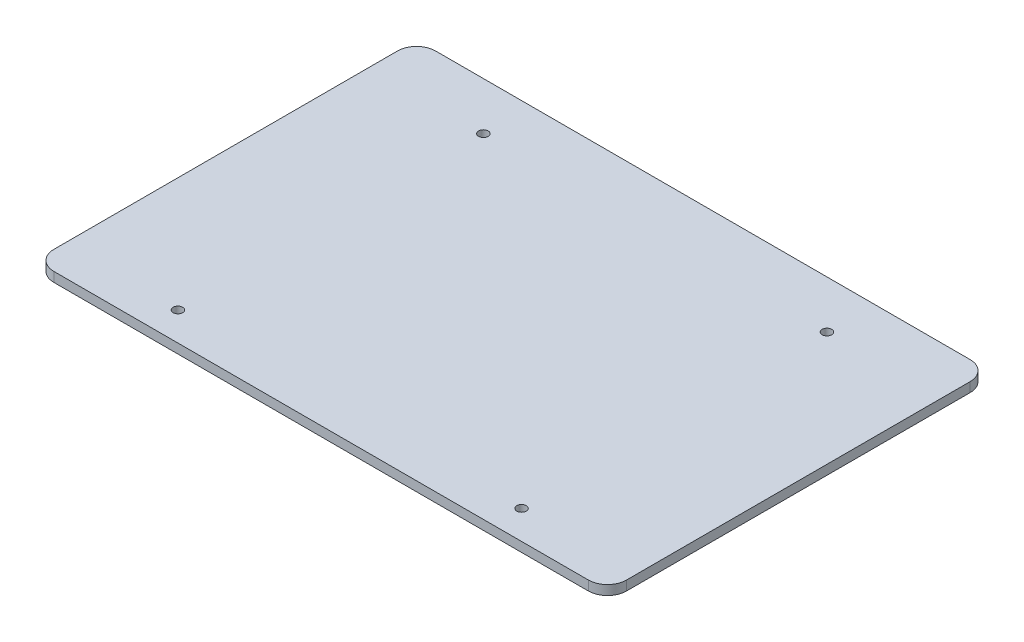
ISO-10303-21;
HEADER;
FILE_DESCRIPTION(('STEP AP214'),'2;1');
FILE_NAME('part.step','',(''),(''),'','','');
FILE_SCHEMA(('AUTOMOTIVE_DESIGN { 1 0 10303 214 1 1 1 1 }'));
ENDSEC;
DATA;
#1=APPLICATION_CONTEXT('core data for automotive mechanical design processes');
#2=APPLICATION_PROTOCOL_DEFINITION('international standard','automotive_design',2000,#1);
#3=PRODUCT_CONTEXT('',#1,'mechanical');
#4=PRODUCT('Part','Part','',(#3));
#5=PRODUCT_RELATED_PRODUCT_CATEGORY('part','',(#4));
#6=PRODUCT_DEFINITION_FORMATION('','',#4);
#7=PRODUCT_DEFINITION_CONTEXT('part definition',#1,'design');
#8=PRODUCT_DEFINITION('design','',#6,#7);
#9=PRODUCT_DEFINITION_SHAPE('','',#8);
#10=(LENGTH_UNIT() NAMED_UNIT(*) SI_UNIT(.MILLI.,.METRE.));
#11=(NAMED_UNIT(*) PLANE_ANGLE_UNIT() SI_UNIT($,.RADIAN.));
#12=(NAMED_UNIT(*) SI_UNIT($,.STERADIAN.) SOLID_ANGLE_UNIT());
#13=UNCERTAINTY_MEASURE_WITH_UNIT(LENGTH_MEASURE(1.E-05),#10,'distance_accuracy_value','');
#14=(GEOMETRIC_REPRESENTATION_CONTEXT(3) GLOBAL_UNCERTAINTY_ASSIGNED_CONTEXT((#13)) GLOBAL_UNIT_ASSIGNED_CONTEXT((#10,
#11,#12)) REPRESENTATION_CONTEXT('',''));
#15=CARTESIAN_POINT('',(0.,0.,0.));
#16=DIRECTION('',(0.,0.,1.));
#17=DIRECTION('',(1.,0.,0.));
#18=AXIS2_PLACEMENT_3D('',#15,#16,#17);
#19=CARTESIAN_POINT('',(140.,5.,90.));
#20=DIRECTION('',(0.,-1.,0.));
#21=DIRECTION('',(0.,0.,-1.));
#22=AXIS2_PLACEMENT_3D('',#19,#20,#21);
#23=PLANE('',#22);
#24=CARTESIAN_POINT('',(140.,5.,90.));
#25=DIRECTION('',(0.,1.,0.));
#26=DIRECTION('',(0.,0.,-1.));
#27=AXIS2_PLACEMENT_3D('',#24,#25,#26);
#28=CIRCLE('',#27,10.);
#29=CARTESIAN_POINT('',(140.,5.,100.));
#30=VERTEX_POINT('',#29);
#31=CARTESIAN_POINT('',(150.,5.,90.));
#32=VERTEX_POINT('',#31);
#33=EDGE_CURVE('E146',#30,#32,#28,.T.);
#34=ORIENTED_EDGE('',*,*,#33,.T.);
#35=DIRECTION('',(0.,0.,-1.));
#36=VECTOR('',#35,1.);
#37=CARTESIAN_POINT('',(150.,5.,90.));
#38=LINE('',#37,#36);
#39=CARTESIAN_POINT('',(150.,5.,-90.));
#40=VERTEX_POINT('',#39);
#41=EDGE_CURVE('E94',#32,#40,#38,.T.);
#42=ORIENTED_EDGE('',*,*,#41,.T.);
#43=CARTESIAN_POINT('',(140.,5.,-90.));
#44=DIRECTION('',(0.,1.,0.));
#45=DIRECTION('',(0.,0.,-1.));
#46=AXIS2_PLACEMENT_3D('',#43,#44,#45);
#47=CIRCLE('',#46,10.);
#48=CARTESIAN_POINT('',(140.,5.,-100.));
#49=VERTEX_POINT('',#48);
#50=EDGE_CURVE('E161',#40,#49,#47,.T.);
#51=ORIENTED_EDGE('',*,*,#50,.T.);
#52=DIRECTION('',(-1.,0.,0.));
#53=VECTOR('',#52,1.);
#54=CARTESIAN_POINT('',(-140.,5.,-100.));
#55=LINE('',#54,#53);
#56=CARTESIAN_POINT('',(-140.,5.,-100.));
#57=VERTEX_POINT('',#56);
#58=EDGE_CURVE('E174',#49,#57,#55,.T.);
#59=ORIENTED_EDGE('',*,*,#58,.T.);
#60=CARTESIAN_POINT('',(-140.,5.,-90.));
#61=DIRECTION('',(0.,1.,0.));
#62=DIRECTION('',(0.,0.,1.));
#63=AXIS2_PLACEMENT_3D('',#60,#61,#62);
#64=CIRCLE('',#63,10.);
#65=CARTESIAN_POINT('',(-150.,5.,-90.));
#66=VERTEX_POINT('',#65);
#67=EDGE_CURVE('E113',#57,#66,#64,.T.);
#68=ORIENTED_EDGE('',*,*,#67,.T.);
#69=DIRECTION('',(0.,0.,1.));
#70=VECTOR('',#69,1.);
#71=CARTESIAN_POINT('',(-150.,5.,90.));
#72=LINE('',#71,#70);
#73=CARTESIAN_POINT('',(-150.,5.,90.));
#74=VERTEX_POINT('',#73);
#75=EDGE_CURVE('E107',#66,#74,#72,.T.);
#76=ORIENTED_EDGE('',*,*,#75,.T.);
#77=CARTESIAN_POINT('',(-140.,5.,90.));
#78=DIRECTION('',(0.,1.,0.));
#79=DIRECTION('',(0.,0.,-1.));
#80=AXIS2_PLACEMENT_3D('',#77,#78,#79);
#81=CIRCLE('',#80,10.);
#82=CARTESIAN_POINT('',(-140.,5.,100.));
#83=VERTEX_POINT('',#82);
#84=EDGE_CURVE('E111',#74,#83,#81,.T.);
#85=ORIENTED_EDGE('',*,*,#84,.T.);
#86=DIRECTION('',(1.,0.,0.));
#87=VECTOR('',#86,1.);
#88=CARTESIAN_POINT('',(-140.,5.,100.));
#89=LINE('',#88,#87);
#90=EDGE_CURVE('E51',#83,#30,#89,.T.);
#91=ORIENTED_EDGE('',*,*,#90,.T.);
#92=EDGE_LOOP('',(#34,#42,#51,#59,#68,#76,#85,#91));
#93=FACE_BOUND('',#92,.T.);
#94=CARTESIAN_POINT('',(-89.9999999999999,5.,85.));
#95=DIRECTION('',(0.,1.,0.));
#96=DIRECTION('',(0.,0.,1.));
#97=AXIS2_PLACEMENT_3D('',#94,#95,#96);
#98=CIRCLE('',#97,2.5);
#99=CARTESIAN_POINT('',(-89.9999999999999,5.,87.5));
#100=VERTEX_POINT('',#99);
#101=EDGE_CURVE('E135',#100,#100,#98,.T.);
#102=ORIENTED_EDGE('',*,*,#101,.F.);
#103=EDGE_LOOP('',(#102));
#104=FACE_BOUND('',#103,.T.);
#105=CARTESIAN_POINT('',(90.0000000000001,5.,85.));
#106=DIRECTION('',(0.,1.,0.));
#107=DIRECTION('',(0.,0.,1.));
#108=AXIS2_PLACEMENT_3D('',#105,#106,#107);
#109=CIRCLE('',#108,2.5);
#110=CARTESIAN_POINT('',(90.0000000000001,5.,87.5));
#111=VERTEX_POINT('',#110);
#112=EDGE_CURVE('E183',#111,#111,#109,.T.);
#113=ORIENTED_EDGE('',*,*,#112,.F.);
#114=EDGE_LOOP('',(#113));
#115=FACE_BOUND('',#114,.T.);
#116=CARTESIAN_POINT('',(90.,5.,-75.));
#117=DIRECTION('',(0.,1.,0.));
#118=DIRECTION('',(0.,0.,1.));
#119=AXIS2_PLACEMENT_3D('',#116,#117,#118);
#120=CIRCLE('',#119,2.50000000000001);
#121=CARTESIAN_POINT('',(90.,5.,-72.5));
#122=VERTEX_POINT('',#121);
#123=EDGE_CURVE('E189',#122,#122,#120,.T.);
#124=ORIENTED_EDGE('',*,*,#123,.F.);
#125=EDGE_LOOP('',(#124));
#126=FACE_BOUND('',#125,.T.);
#127=CARTESIAN_POINT('',(-89.9999999999999,5.,-75.));
#128=DIRECTION('',(0.,1.,0.));
#129=DIRECTION('',(0.,0.,1.));
#130=AXIS2_PLACEMENT_3D('',#127,#128,#129);
#131=CIRCLE('',#130,2.5);
#132=CARTESIAN_POINT('',(-89.9999999999999,5.,-72.5));
#133=VERTEX_POINT('',#132);
#134=EDGE_CURVE('E195',#133,#133,#131,.T.);
#135=ORIENTED_EDGE('',*,*,#134,.F.);
#136=EDGE_LOOP('',(#135));
#137=FACE_BOUND('',#136,.T.);
#138=ADVANCED_FACE('F34',(#93,#104,#115,#126,#137),#23,.F.);
#139=CARTESIAN_POINT('',(140.,0.,90.));
#140=DIRECTION('',(0.,-1.,0.));
#141=DIRECTION('',(0.,0.,-1.));
#142=AXIS2_PLACEMENT_3D('',#139,#140,#141);
#143=PLANE('',#142);
#144=CARTESIAN_POINT('',(90.,0.,-75.));
#145=DIRECTION('',(0.,1.,0.));
#146=DIRECTION('',(0.,0.,1.));
#147=AXIS2_PLACEMENT_3D('',#144,#145,#146);
#148=CIRCLE('',#147,2.50000000000001);
#149=CARTESIAN_POINT('',(90.,0.,-72.5));
#150=VERTEX_POINT('',#149);
#151=EDGE_CURVE('E192',#150,#150,#148,.T.);
#152=ORIENTED_EDGE('',*,*,#151,.T.);
#153=EDGE_LOOP('',(#152));
#154=FACE_BOUND('',#153,.T.);
#155=CARTESIAN_POINT('',(-89.9999999999999,0.,85.));
#156=DIRECTION('',(0.,1.,0.));
#157=DIRECTION('',(0.,0.,1.));
#158=AXIS2_PLACEMENT_3D('',#155,#156,#157);
#159=CIRCLE('',#158,2.5);
#160=CARTESIAN_POINT('',(-89.9999999999999,0.,87.5));
#161=VERTEX_POINT('',#160);
#162=EDGE_CURVE('E180',#161,#161,#159,.T.);
#163=ORIENTED_EDGE('',*,*,#162,.T.);
#164=EDGE_LOOP('',(#163));
#165=FACE_BOUND('',#164,.T.);
#166=CARTESIAN_POINT('',(140.,0.,90.));
#167=DIRECTION('',(0.,1.,0.));
#168=DIRECTION('',(0.,0.,-1.));
#169=AXIS2_PLACEMENT_3D('',#166,#167,#168);
#170=CIRCLE('',#169,10.);
#171=CARTESIAN_POINT('',(140.,0.,100.));
#172=VERTEX_POINT('',#171);
#173=CARTESIAN_POINT('',(150.,0.,90.));
#174=VERTEX_POINT('',#173);
#175=EDGE_CURVE('E131',#172,#174,#170,.T.);
#176=ORIENTED_EDGE('',*,*,#175,.F.);
#177=DIRECTION('',(1.,0.,0.));
#178=VECTOR('',#177,1.);
#179=CARTESIAN_POINT('',(-140.,0.,100.));
#180=LINE('',#179,#178);
#181=CARTESIAN_POINT('',(-140.,0.,100.));
#182=VERTEX_POINT('',#181);
#183=EDGE_CURVE('E86',#182,#172,#180,.T.);
#184=ORIENTED_EDGE('',*,*,#183,.F.);
#185=CARTESIAN_POINT('',(-140.,0.,90.));
#186=DIRECTION('',(0.,1.,0.));
#187=DIRECTION('',(0.,0.,-1.));
#188=AXIS2_PLACEMENT_3D('',#185,#186,#187);
#189=CIRCLE('',#188,10.);
#190=CARTESIAN_POINT('',(-150.,0.,90.));
#191=VERTEX_POINT('',#190);
#192=EDGE_CURVE('E80',#191,#182,#189,.T.);
#193=ORIENTED_EDGE('',*,*,#192,.F.);
#194=DIRECTION('',(0.,0.,1.));
#195=VECTOR('',#194,1.);
#196=CARTESIAN_POINT('',(-150.,0.,90.));
#197=LINE('',#196,#195);
#198=CARTESIAN_POINT('',(-150.,0.,-90.));
#199=VERTEX_POINT('',#198);
#200=EDGE_CURVE('E121',#199,#191,#197,.T.);
#201=ORIENTED_EDGE('',*,*,#200,.F.);
#202=CARTESIAN_POINT('',(-140.,0.,-90.));
#203=DIRECTION('',(0.,1.,0.));
#204=DIRECTION('',(0.,0.,1.));
#205=AXIS2_PLACEMENT_3D('',#202,#203,#204);
#206=CIRCLE('',#205,10.);
#207=CARTESIAN_POINT('',(-140.,0.,-100.));
#208=VERTEX_POINT('',#207);
#209=EDGE_CURVE('E141',#208,#199,#206,.T.);
#210=ORIENTED_EDGE('',*,*,#209,.F.);
#211=DIRECTION('',(-1.,0.,0.));
#212=VECTOR('',#211,1.);
#213=CARTESIAN_POINT('',(-140.,0.,-100.));
#214=LINE('',#213,#212);
#215=CARTESIAN_POINT('',(140.,0.,-100.));
#216=VERTEX_POINT('',#215);
#217=EDGE_CURVE('E139',#216,#208,#214,.T.);
#218=ORIENTED_EDGE('',*,*,#217,.F.);
#219=CARTESIAN_POINT('',(140.,0.,-90.));
#220=DIRECTION('',(0.,1.,0.));
#221=DIRECTION('',(0.,0.,-1.));
#222=AXIS2_PLACEMENT_3D('',#219,#220,#221);
#223=CIRCLE('',#222,10.);
#224=CARTESIAN_POINT('',(150.,0.,-90.));
#225=VERTEX_POINT('',#224);
#226=EDGE_CURVE('E137',#225,#216,#223,.T.);
#227=ORIENTED_EDGE('',*,*,#226,.F.);
#228=DIRECTION('',(0.,0.,-1.));
#229=VECTOR('',#228,1.);
#230=CARTESIAN_POINT('',(150.,0.,90.));
#231=LINE('',#230,#229);
#232=EDGE_CURVE('E134',#174,#225,#231,.T.);
#233=ORIENTED_EDGE('',*,*,#232,.F.);
#234=EDGE_LOOP('',(#176,#184,#193,#201,#210,#218,#227,#233));
#235=FACE_BOUND('',#234,.T.);
#236=CARTESIAN_POINT('',(90.0000000000001,0.,85.));
#237=DIRECTION('',(0.,1.,0.));
#238=DIRECTION('',(0.,0.,1.));
#239=AXIS2_PLACEMENT_3D('',#236,#237,#238);
#240=CIRCLE('',#239,2.5);
#241=CARTESIAN_POINT('',(90.0000000000001,0.,87.5));
#242=VERTEX_POINT('',#241);
#243=EDGE_CURVE('E186',#242,#242,#240,.T.);
#244=ORIENTED_EDGE('',*,*,#243,.T.);
#245=EDGE_LOOP('',(#244));
#246=FACE_BOUND('',#245,.T.);
#247=CARTESIAN_POINT('',(-89.9999999999999,0.,-75.));
#248=DIRECTION('',(0.,1.,0.));
#249=DIRECTION('',(0.,0.,1.));
#250=AXIS2_PLACEMENT_3D('',#247,#248,#249);
#251=CIRCLE('',#250,2.5);
#252=CARTESIAN_POINT('',(-89.9999999999999,0.,-72.5));
#253=VERTEX_POINT('',#252);
#254=EDGE_CURVE('E198',#253,#253,#251,.T.);
#255=ORIENTED_EDGE('',*,*,#254,.T.);
#256=EDGE_LOOP('',(#255));
#257=FACE_BOUND('',#256,.T.);
#258=ADVANCED_FACE('F165',(#154,#165,#235,#246,#257),#143,.T.);
#259=CARTESIAN_POINT('',(140.,5.,90.));
#260=DIRECTION('',(0.,-1.,0.));
#261=DIRECTION('',(0.,0.,-1.));
#262=AXIS2_PLACEMENT_3D('',#259,#260,#261);
#263=CYLINDRICAL_SURFACE('',#262,10.);
#264=ORIENTED_EDGE('',*,*,#175,.T.);
#265=DIRECTION('',(0.,-1.,0.));
#266=VECTOR('',#265,1.);
#267=CARTESIAN_POINT('',(150.,5.,90.));
#268=LINE('',#267,#266);
#269=EDGE_CURVE('E11',#32,#174,#268,.T.);
#270=ORIENTED_EDGE('',*,*,#269,.F.);
#271=ORIENTED_EDGE('',*,*,#33,.F.);
#272=DIRECTION('',(0.,-1.,0.));
#273=VECTOR('',#272,1.);
#274=CARTESIAN_POINT('',(140.,5.,100.));
#275=LINE('',#274,#273);
#276=EDGE_CURVE('E127',#30,#172,#275,.T.);
#277=ORIENTED_EDGE('',*,*,#276,.T.);
#278=EDGE_LOOP('',(#264,#270,#271,#277));
#279=FACE_BOUND('',#278,.T.);
#280=ADVANCED_FACE('F36',(#279),#263,.T.);
#281=CARTESIAN_POINT('',(150.,5.,90.));
#282=DIRECTION('',(-1.,0.,0.));
#283=DIRECTION('',(0.,0.,1.));
#284=AXIS2_PLACEMENT_3D('',#281,#282,#283);
#285=PLANE('',#284);
#286=ORIENTED_EDGE('',*,*,#232,.T.);
#287=DIRECTION('',(0.,-1.,0.));
#288=VECTOR('',#287,1.);
#289=CARTESIAN_POINT('',(150.,5.,-90.));
#290=LINE('',#289,#288);
#291=EDGE_CURVE('E43',#40,#225,#290,.T.);
#292=ORIENTED_EDGE('',*,*,#291,.F.);
#293=ORIENTED_EDGE('',*,*,#41,.F.);
#294=ORIENTED_EDGE('',*,*,#269,.T.);
#295=EDGE_LOOP('',(#286,#292,#293,#294));
#296=FACE_BOUND('',#295,.T.);
#297=ADVANCED_FACE('F230',(#296),#285,.F.);
#298=CARTESIAN_POINT('',(140.,5.,-90.));
#299=DIRECTION('',(0.,-1.,0.));
#300=DIRECTION('',(0.,0.,-1.));
#301=AXIS2_PLACEMENT_3D('',#298,#299,#300);
#302=CYLINDRICAL_SURFACE('',#301,10.);
#303=ORIENTED_EDGE('',*,*,#226,.T.);
#304=DIRECTION('',(0.,-1.,0.));
#305=VECTOR('',#304,1.);
#306=CARTESIAN_POINT('',(140.,5.,-100.));
#307=LINE('',#306,#305);
#308=EDGE_CURVE('E153',#49,#216,#307,.T.);
#309=ORIENTED_EDGE('',*,*,#308,.F.);
#310=ORIENTED_EDGE('',*,*,#50,.F.);
#311=ORIENTED_EDGE('',*,*,#291,.T.);
#312=EDGE_LOOP('',(#303,#309,#310,#311));
#313=FACE_BOUND('',#312,.T.);
#314=ADVANCED_FACE('F159',(#313),#302,.T.);
#315=CARTESIAN_POINT('',(-140.,5.,-100.));
#316=DIRECTION('',(0.,0.,1.));
#317=DIRECTION('',(1.,0.,0.));
#318=AXIS2_PLACEMENT_3D('',#315,#316,#317);
#319=PLANE('',#318);
#320=ORIENTED_EDGE('',*,*,#217,.T.);
#321=DIRECTION('',(0.,-1.,0.));
#322=VECTOR('',#321,1.);
#323=CARTESIAN_POINT('',(-140.,5.,-100.));
#324=LINE('',#323,#322);
#325=EDGE_CURVE('E150',#57,#208,#324,.T.);
#326=ORIENTED_EDGE('',*,*,#325,.F.);
#327=ORIENTED_EDGE('',*,*,#58,.F.);
#328=ORIENTED_EDGE('',*,*,#308,.T.);
#329=EDGE_LOOP('',(#320,#326,#327,#328));
#330=FACE_BOUND('',#329,.T.);
#331=ADVANCED_FACE('F170',(#330),#319,.F.);
#332=CARTESIAN_POINT('',(-140.,5.,-90.));
#333=DIRECTION('',(0.,-1.,0.));
#334=DIRECTION('',(0.,0.,-1.));
#335=AXIS2_PLACEMENT_3D('',#332,#333,#334);
#336=CYLINDRICAL_SURFACE('',#335,10.);
#337=ORIENTED_EDGE('',*,*,#209,.T.);
#338=DIRECTION('',(0.,-1.,0.));
#339=VECTOR('',#338,1.);
#340=CARTESIAN_POINT('',(-150.,5.,-90.));
#341=LINE('',#340,#339);
#342=EDGE_CURVE('E122',#66,#199,#341,.T.);
#343=ORIENTED_EDGE('',*,*,#342,.F.);
#344=ORIENTED_EDGE('',*,*,#67,.F.);
#345=ORIENTED_EDGE('',*,*,#325,.T.);
#346=EDGE_LOOP('',(#337,#343,#344,#345));
#347=FACE_BOUND('',#346,.T.);
#348=ADVANCED_FACE('F173',(#347),#336,.T.);
#349=CARTESIAN_POINT('',(-150.,5.,90.));
#350=DIRECTION('',(1.,0.,0.));
#351=DIRECTION('',(0.,0.,-1.));
#352=AXIS2_PLACEMENT_3D('',#349,#350,#351);
#353=PLANE('',#352);
#354=ORIENTED_EDGE('',*,*,#200,.T.);
#355=DIRECTION('',(0.,-1.,0.));
#356=VECTOR('',#355,1.);
#357=CARTESIAN_POINT('',(-150.,5.,90.));
#358=LINE('',#357,#356);
#359=EDGE_CURVE('E118',#74,#191,#358,.T.);
#360=ORIENTED_EDGE('',*,*,#359,.F.);
#361=ORIENTED_EDGE('',*,*,#75,.F.);
#362=ORIENTED_EDGE('',*,*,#342,.T.);
#363=EDGE_LOOP('',(#354,#360,#361,#362));
#364=FACE_BOUND('',#363,.T.);
#365=ADVANCED_FACE('F119',(#364),#353,.F.);
#366=CARTESIAN_POINT('',(-140.,5.,90.));
#367=DIRECTION('',(0.,-1.,0.));
#368=DIRECTION('',(0.,0.,-1.));
#369=AXIS2_PLACEMENT_3D('',#366,#367,#368);
#370=CYLINDRICAL_SURFACE('',#369,10.);
#371=ORIENTED_EDGE('',*,*,#192,.T.);
#372=DIRECTION('',(0.,-1.,0.));
#373=VECTOR('',#372,1.);
#374=CARTESIAN_POINT('',(-140.,5.,100.));
#375=LINE('',#374,#373);
#376=EDGE_CURVE('E123',#83,#182,#375,.T.);
#377=ORIENTED_EDGE('',*,*,#376,.F.);
#378=ORIENTED_EDGE('',*,*,#84,.F.);
#379=ORIENTED_EDGE('',*,*,#359,.T.);
#380=EDGE_LOOP('',(#371,#377,#378,#379));
#381=FACE_BOUND('',#380,.T.);
#382=ADVANCED_FACE('F125',(#381),#370,.T.);
#383=CARTESIAN_POINT('',(-140.,5.,100.));
#384=DIRECTION('',(0.,0.,-1.));
#385=DIRECTION('',(-1.,0.,0.));
#386=AXIS2_PLACEMENT_3D('',#383,#384,#385);
#387=PLANE('',#386);
#388=ORIENTED_EDGE('',*,*,#183,.T.);
#389=ORIENTED_EDGE('',*,*,#276,.F.);
#390=ORIENTED_EDGE('',*,*,#90,.F.);
#391=ORIENTED_EDGE('',*,*,#376,.T.);
#392=EDGE_LOOP('',(#388,#389,#390,#391));
#393=FACE_BOUND('',#392,.T.);
#394=ADVANCED_FACE('F218',(#393),#387,.F.);
#395=CARTESIAN_POINT('',(-89.9999999999999,5.,85.));
#396=DIRECTION('',(0.,-1.,0.));
#397=DIRECTION('',(0.,0.,-1.));
#398=AXIS2_PLACEMENT_3D('',#395,#396,#397);
#399=CYLINDRICAL_SURFACE('',#398,2.5);
#400=ORIENTED_EDGE('',*,*,#101,.T.);
#401=EDGE_LOOP('',(#400));
#402=FACE_BOUND('',#401,.T.);
#403=ORIENTED_EDGE('',*,*,#162,.F.);
#404=EDGE_LOOP('',(#403));
#405=FACE_BOUND('',#404,.T.);
#406=ADVANCED_FACE('F215',(#402,#405),#399,.F.);
#407=CARTESIAN_POINT('',(90.0000000000001,5.,85.));
#408=DIRECTION('',(0.,-1.,0.));
#409=DIRECTION('',(0.,0.,-1.));
#410=AXIS2_PLACEMENT_3D('',#407,#408,#409);
#411=CYLINDRICAL_SURFACE('',#410,2.5);
#412=ORIENTED_EDGE('',*,*,#112,.T.);
#413=EDGE_LOOP('',(#412));
#414=FACE_BOUND('',#413,.T.);
#415=ORIENTED_EDGE('',*,*,#243,.F.);
#416=EDGE_LOOP('',(#415));
#417=FACE_BOUND('',#416,.T.);
#418=ADVANCED_FACE('F294',(#414,#417),#411,.F.);
#419=CARTESIAN_POINT('',(90.,5.,-75.));
#420=DIRECTION('',(0.,-1.,0.));
#421=DIRECTION('',(0.,0.,-1.));
#422=AXIS2_PLACEMENT_3D('',#419,#420,#421);
#423=CYLINDRICAL_SURFACE('',#422,2.50000000000001);
#424=ORIENTED_EDGE('',*,*,#123,.T.);
#425=EDGE_LOOP('',(#424));
#426=FACE_BOUND('',#425,.T.);
#427=ORIENTED_EDGE('',*,*,#151,.F.);
#428=EDGE_LOOP('',(#427));
#429=FACE_BOUND('',#428,.T.);
#430=ADVANCED_FACE('F302',(#426,#429),#423,.F.);
#431=CARTESIAN_POINT('',(-89.9999999999999,5.,-75.));
#432=DIRECTION('',(0.,-1.,0.));
#433=DIRECTION('',(0.,0.,-1.));
#434=AXIS2_PLACEMENT_3D('',#431,#432,#433);
#435=CYLINDRICAL_SURFACE('',#434,2.5);
#436=ORIENTED_EDGE('',*,*,#134,.T.);
#437=EDGE_LOOP('',(#436));
#438=FACE_BOUND('',#437,.T.);
#439=ORIENTED_EDGE('',*,*,#254,.F.);
#440=EDGE_LOOP('',(#439));
#441=FACE_BOUND('',#440,.T.);
#442=ADVANCED_FACE('F204',(#438,#441),#435,.F.);
#443=CLOSED_SHELL('',(#138,#258,#280,#297,#314,#331,#348,#365,#382,#394,#406,#418,#430,#442));
#444=MANIFOLD_SOLID_BREP('B2',#443);
#445=ADVANCED_BREP_SHAPE_REPRESENTATION('',(#18,#444),#14);
#446=SHAPE_DEFINITION_REPRESENTATION(#9,#445);
ENDSEC;
END-ISO-10303-21;
